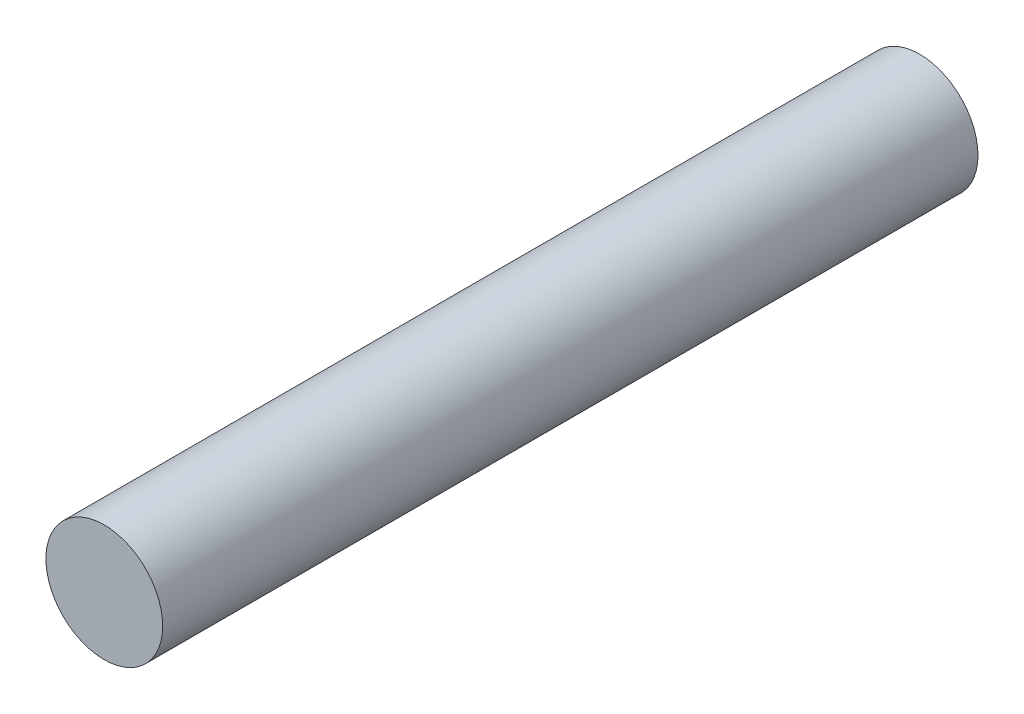
ISO-10303-21;
HEADER;
FILE_DESCRIPTION(('STEP AP214'),'2;1');
FILE_NAME('part.step','',(''),(''),'','','');
FILE_SCHEMA(('AUTOMOTIVE_DESIGN { 1 0 10303 214 1 1 1 1 }'));
ENDSEC;
DATA;
#1=APPLICATION_CONTEXT('core data for automotive mechanical design processes');
#2=APPLICATION_PROTOCOL_DEFINITION('international standard','automotive_design',2000,#1);
#3=PRODUCT_CONTEXT('',#1,'mechanical');
#4=PRODUCT('Part','Part','',(#3));
#5=PRODUCT_RELATED_PRODUCT_CATEGORY('part','',(#4));
#6=PRODUCT_DEFINITION_FORMATION('','',#4);
#7=PRODUCT_DEFINITION_CONTEXT('part definition',#1,'design');
#8=PRODUCT_DEFINITION('design','',#6,#7);
#9=PRODUCT_DEFINITION_SHAPE('','',#8);
#10=(LENGTH_UNIT() NAMED_UNIT(*) SI_UNIT(.MILLI.,.METRE.));
#11=(NAMED_UNIT(*) PLANE_ANGLE_UNIT() SI_UNIT($,.RADIAN.));
#12=(NAMED_UNIT(*) SI_UNIT($,.STERADIAN.) SOLID_ANGLE_UNIT());
#13=UNCERTAINTY_MEASURE_WITH_UNIT(LENGTH_MEASURE(1.E-05),#10,'distance_accuracy_value','');
#14=(GEOMETRIC_REPRESENTATION_CONTEXT(3) GLOBAL_UNCERTAINTY_ASSIGNED_CONTEXT((#13)) GLOBAL_UNIT_ASSIGNED_CONTEXT((#10,
#11,#12)) REPRESENTATION_CONTEXT('',''));
#15=CARTESIAN_POINT('',(0.,0.,0.));
#16=DIRECTION('',(0.,0.,1.));
#17=DIRECTION('',(1.,0.,0.));
#18=AXIS2_PLACEMENT_3D('',#15,#16,#17);
#19=CARTESIAN_POINT('',(-312.495508130218,-65.4669360607999,640.));
#20=DIRECTION('',(0.,0.,-1.));
#21=DIRECTION('',(-1.,0.,0.));
#22=AXIS2_PLACEMENT_3D('',#19,#20,#21);
#23=CYLINDRICAL_SURFACE('',#22,45.82477688);
#24=CARTESIAN_POINT('',(-312.495508130218,-65.4669360607999,640.));
#25=DIRECTION('',(0.,0.,1.));
#26=DIRECTION('',(1.,0.,0.));
#27=AXIS2_PLACEMENT_3D('',#24,#25,#26);
#28=CIRCLE('',#27,45.82477688);
#29=CARTESIAN_POINT('',(-266.670731250218,-65.4669360607999,640.));
#30=VERTEX_POINT('',#29);
#31=EDGE_CURVE('E10',#30,#30,#28,.T.);
#32=ORIENTED_EDGE('',*,*,#31,.F.);
#33=EDGE_LOOP('',(#32));
#34=FACE_BOUND('',#33,.T.);
#35=CARTESIAN_POINT('',(-312.495508130218,-65.4669360607999,0.));
#36=DIRECTION('',(0.,0.,1.));
#37=DIRECTION('',(1.,0.,0.));
#38=AXIS2_PLACEMENT_3D('',#35,#36,#37);
#39=CIRCLE('',#38,45.82477688);
#40=CARTESIAN_POINT('',(-266.670731250218,-65.4669360607999,0.));
#41=VERTEX_POINT('',#40);
#42=EDGE_CURVE('E34',#41,#41,#39,.T.);
#43=ORIENTED_EDGE('',*,*,#42,.T.);
#44=EDGE_LOOP('',(#43));
#45=FACE_BOUND('',#44,.T.);
#46=ADVANCED_FACE('F31',(#34,#45),#23,.T.);
#47=CARTESIAN_POINT('',(-312.495508130218,-65.4669360607999,640.));
#48=DIRECTION('',(0.,0.,1.));
#49=DIRECTION('',(1.,0.,0.));
#50=AXIS2_PLACEMENT_3D('',#47,#48,#49);
#51=PLANE('',#50);
#52=ORIENTED_EDGE('',*,*,#31,.T.);
#53=EDGE_LOOP('',(#52));
#54=FACE_BOUND('',#53,.T.);
#55=ADVANCED_FACE('F46',(#54),#51,.T.);
#56=CARTESIAN_POINT('',(-312.495508130218,-65.4669360607999,0.));
#57=DIRECTION('',(0.,0.,1.));
#58=DIRECTION('',(1.,0.,0.));
#59=AXIS2_PLACEMENT_3D('',#56,#57,#58);
#60=PLANE('',#59);
#61=ORIENTED_EDGE('',*,*,#42,.F.);
#62=EDGE_LOOP('',(#61));
#63=FACE_BOUND('',#62,.T.);
#64=ADVANCED_FACE('F44',(#63),#60,.F.);
#65=CLOSED_SHELL('',(#46,#55,#64));
#66=MANIFOLD_SOLID_BREP('B2',#65);
#67=ADVANCED_BREP_SHAPE_REPRESENTATION('',(#18,#66),#14);
#68=SHAPE_DEFINITION_REPRESENTATION(#9,#67);
ENDSEC;
END-ISO-10303-21;
